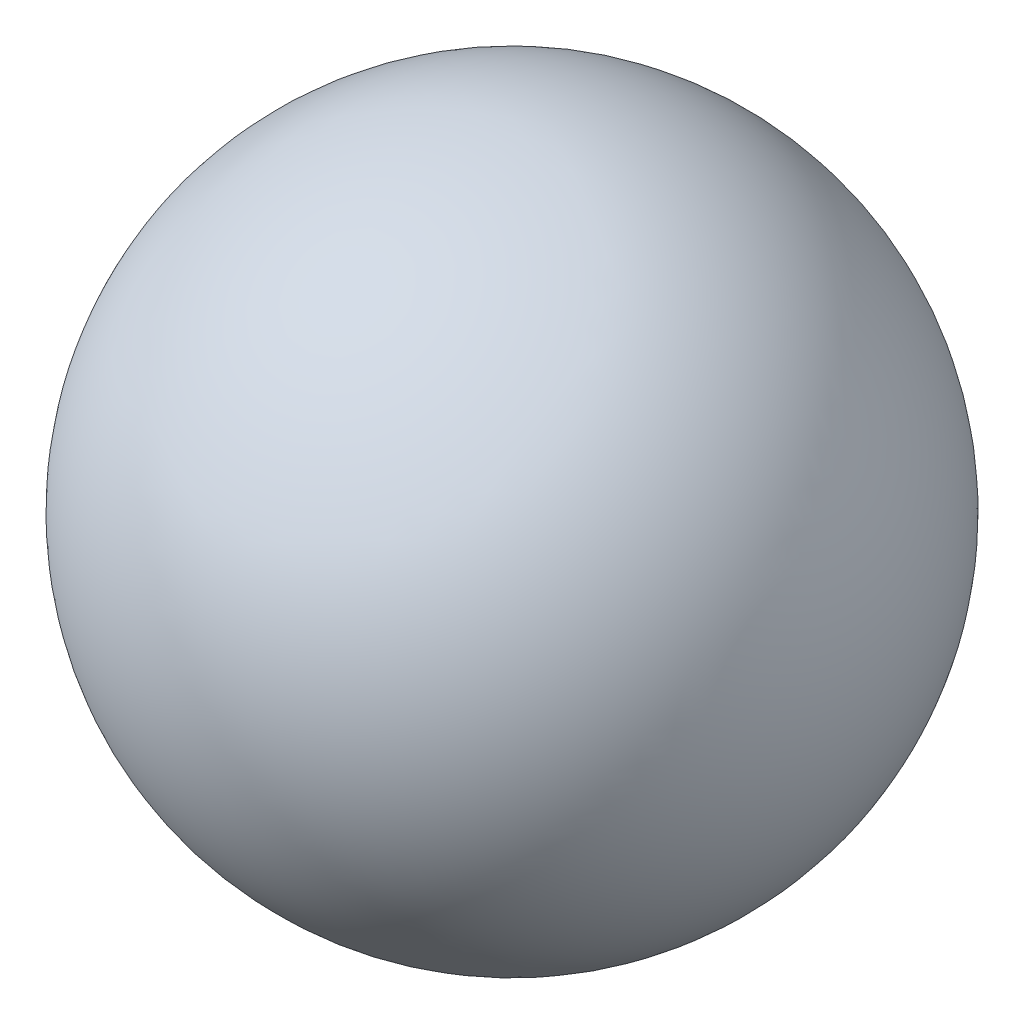
ISO-10303-21;
HEADER;
FILE_DESCRIPTION(('STEP AP214'),'2;1');
FILE_NAME('part.step','',(''),(''),'','','');
FILE_SCHEMA(('AUTOMOTIVE_DESIGN { 1 0 10303 214 1 1 1 1 }'));
ENDSEC;
DATA;
#1=APPLICATION_CONTEXT('core data for automotive mechanical design processes');
#2=APPLICATION_PROTOCOL_DEFINITION('international standard','automotive_design',2000,#1);
#3=PRODUCT_CONTEXT('',#1,'mechanical');
#4=PRODUCT('Part','Part','',(#3));
#5=PRODUCT_RELATED_PRODUCT_CATEGORY('part','',(#4));
#6=PRODUCT_DEFINITION_FORMATION('','',#4);
#7=PRODUCT_DEFINITION_CONTEXT('part definition',#1,'design');
#8=PRODUCT_DEFINITION('design','',#6,#7);
#9=PRODUCT_DEFINITION_SHAPE('','',#8);
#10=(LENGTH_UNIT() NAMED_UNIT(*) SI_UNIT(.MILLI.,.METRE.));
#11=(NAMED_UNIT(*) PLANE_ANGLE_UNIT() SI_UNIT($,.RADIAN.));
#12=(NAMED_UNIT(*) SI_UNIT($,.STERADIAN.) SOLID_ANGLE_UNIT());
#13=UNCERTAINTY_MEASURE_WITH_UNIT(LENGTH_MEASURE(1.E-05),#10,'distance_accuracy_value','');
#14=(GEOMETRIC_REPRESENTATION_CONTEXT(3) GLOBAL_UNCERTAINTY_ASSIGNED_CONTEXT((#13)) GLOBAL_UNIT_ASSIGNED_CONTEXT((#10,
#11,#12)) REPRESENTATION_CONTEXT('',''));
#15=CARTESIAN_POINT('',(0.,0.,0.));
#16=DIRECTION('',(0.,0.,1.));
#17=DIRECTION('',(1.,0.,0.));
#18=AXIS2_PLACEMENT_3D('',#15,#16,#17);
#19=CARTESIAN_POINT('',(0.,0.,0.));
#20=DIRECTION('',(-1.,0.,0.));
#21=DIRECTION('',(0.,0.,-1.));
#22=AXIS2_PLACEMENT_3D('',#19,#20,#21);
#23=SPHERICAL_SURFACE('',#22,5.75);
#24=CARTESIAN_POINT('',(-5.75,0.,0.));
#25=VERTEX_POINT('',#24);
#26=VERTEX_LOOP('',#25);
#27=FACE_BOUND('',#26,.T.);
#28=ADVANCED_FACE('F35',(#27),#23,.T.);
#29=CLOSED_SHELL('',(#28));
#30=MANIFOLD_SOLID_BREP('B2',#29);
#31=ADVANCED_BREP_SHAPE_REPRESENTATION('',(#18,#30),#14);
#32=SHAPE_DEFINITION_REPRESENTATION(#9,#31);
ENDSEC;
END-ISO-10303-21;
